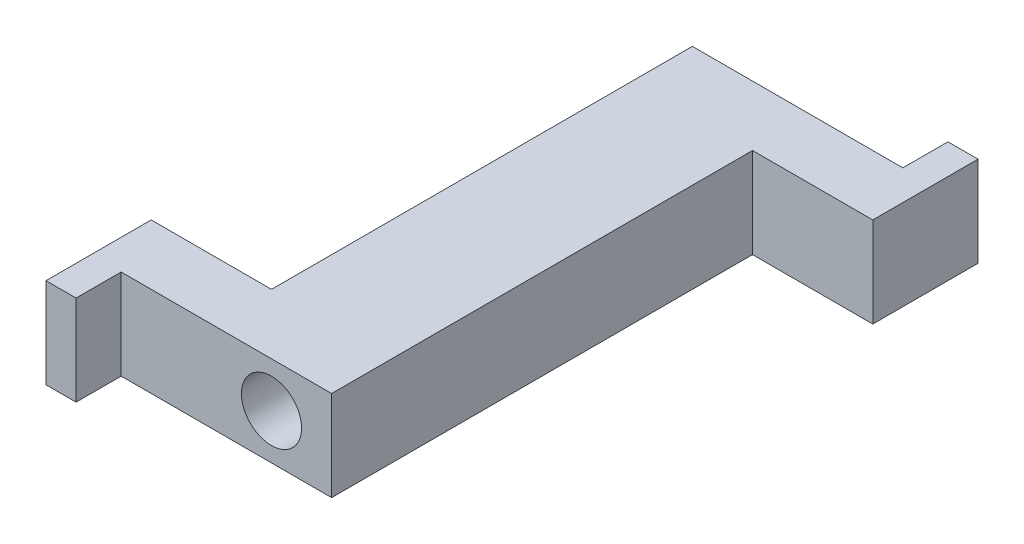
ISO-10303-21;
HEADER;
FILE_DESCRIPTION(('STEP AP214'),'2;1');
FILE_NAME('part.step','',(''),(''),'','','');
FILE_SCHEMA(('AUTOMOTIVE_DESIGN { 1 0 10303 214 1 1 1 1 }'));
ENDSEC;
DATA;
#1=APPLICATION_CONTEXT('core data for automotive mechanical design processes');
#2=APPLICATION_PROTOCOL_DEFINITION('international standard','automotive_design',2000,#1);
#3=PRODUCT_CONTEXT('',#1,'mechanical');
#4=PRODUCT('Part','Part','',(#3));
#5=PRODUCT_RELATED_PRODUCT_CATEGORY('part','',(#4));
#6=PRODUCT_DEFINITION_FORMATION('','',#4);
#7=PRODUCT_DEFINITION_CONTEXT('part definition',#1,'design');
#8=PRODUCT_DEFINITION('design','',#6,#7);
#9=PRODUCT_DEFINITION_SHAPE('','',#8);
#10=(LENGTH_UNIT() NAMED_UNIT(*) SI_UNIT(.MILLI.,.METRE.));
#11=(NAMED_UNIT(*) PLANE_ANGLE_UNIT() SI_UNIT($,.RADIAN.));
#12=(NAMED_UNIT(*) SI_UNIT($,.STERADIAN.) SOLID_ANGLE_UNIT());
#13=UNCERTAINTY_MEASURE_WITH_UNIT(LENGTH_MEASURE(1.E-05),#10,'distance_accuracy_value','');
#14=(GEOMETRIC_REPRESENTATION_CONTEXT(3) GLOBAL_UNCERTAINTY_ASSIGNED_CONTEXT((#13)) GLOBAL_UNIT_ASSIGNED_CONTEXT((#10,
#11,#12)) REPRESENTATION_CONTEXT('',''));
#15=CARTESIAN_POINT('',(0.,0.,0.));
#16=DIRECTION('',(0.,0.,1.));
#17=DIRECTION('',(1.,0.,0.));
#18=AXIS2_PLACEMENT_3D('',#15,#16,#17);
#19=CARTESIAN_POINT('',(0.,0.,0.));
#20=DIRECTION('',(0.,0.,-1.));
#21=DIRECTION('',(-1.,0.,0.));
#22=AXIS2_PLACEMENT_3D('',#19,#20,#21);
#23=PLANE('',#22);
#24=CARTESIAN_POINT('',(-12.7,9.525,0.));
#25=DIRECTION('',(0.,0.,1.));
#26=DIRECTION('',(1.,0.,0.));
#27=AXIS2_PLACEMENT_3D('',#24,#25,#26);
#28=CIRCLE('',#27,6.35);
#29=CARTESIAN_POINT('',(-6.35,9.525,0.));
#30=VERTEX_POINT('',#29);
#31=EDGE_CURVE('E197',#30,#30,#28,.T.);
#32=ORIENTED_EDGE('',*,*,#31,.T.);
#33=EDGE_LOOP('',(#32));
#34=FACE_BOUND('',#33,.T.);
#35=DIRECTION('',(-1.,0.,0.));
#36=VECTOR('',#35,1.);
#37=CARTESIAN_POINT('',(0.,19.05,0.));
#38=LINE('',#37,#36);
#39=CARTESIAN_POINT('',(19.05,19.05,0.));
#40=VERTEX_POINT('',#39);
#41=CARTESIAN_POINT('',(-25.4,19.05,0.));
#42=VERTEX_POINT('',#41);
#43=EDGE_CURVE('E207',#40,#42,#38,.T.);
#44=ORIENTED_EDGE('',*,*,#43,.F.);
#45=DIRECTION('',(0.,-1.,0.));
#46=VECTOR('',#45,1.);
#47=CARTESIAN_POINT('',(19.05,19.05,0.));
#48=LINE('',#47,#46);
#49=CARTESIAN_POINT('',(19.05,0.,0.));
#50=VERTEX_POINT('',#49);
#51=EDGE_CURVE('E127',#40,#50,#48,.T.);
#52=ORIENTED_EDGE('',*,*,#51,.T.);
#53=DIRECTION('',(-1.,0.,0.));
#54=VECTOR('',#53,1.);
#55=CARTESIAN_POINT('',(0.,0.,0.));
#56=LINE('',#55,#54);
#57=CARTESIAN_POINT('',(-25.4,0.,0.));
#58=VERTEX_POINT('',#57);
#59=EDGE_CURVE('E200',#50,#58,#56,.T.);
#60=ORIENTED_EDGE('',*,*,#59,.T.);
#61=DIRECTION('',(0.,1.,0.));
#62=VECTOR('',#61,1.);
#63=CARTESIAN_POINT('',(-25.4,0.,0.));
#64=LINE('',#63,#62);
#65=EDGE_CURVE('E212',#58,#42,#64,.T.);
#66=ORIENTED_EDGE('',*,*,#65,.T.);
#67=EDGE_LOOP('',(#44,#52,#60,#66));
#68=FACE_BOUND('',#67,.T.);
#69=ADVANCED_FACE('F33',(#34,#68),#23,.T.);
#70=CARTESIAN_POINT('',(0.,0.,101.6));
#71=DIRECTION('',(0.,0.,-1.));
#72=DIRECTION('',(-1.,0.,0.));
#73=AXIS2_PLACEMENT_3D('',#70,#71,#72);
#74=PLANE('',#73);
#75=CARTESIAN_POINT('',(-12.7,9.525,101.6));
#76=DIRECTION('',(0.,0.,1.));
#77=DIRECTION('',(1.,0.,0.));
#78=AXIS2_PLACEMENT_3D('',#75,#76,#77);
#79=CIRCLE('',#78,6.35);
#80=CARTESIAN_POINT('',(-6.35,9.525,101.6));
#81=VERTEX_POINT('',#80);
#82=EDGE_CURVE('E196',#81,#81,#79,.T.);
#83=ORIENTED_EDGE('',*,*,#82,.F.);
#84=EDGE_LOOP('',(#83));
#85=FACE_BOUND('',#84,.T.);
#86=DIRECTION('',(0.,1.,0.));
#87=VECTOR('',#86,1.);
#88=CARTESIAN_POINT('',(-44.45,0.,101.6));
#89=LINE('',#88,#87);
#90=CARTESIAN_POINT('',(-44.45,0.,101.6));
#91=VERTEX_POINT('',#90);
#92=CARTESIAN_POINT('',(-44.45,19.05,101.6));
#93=VERTEX_POINT('',#92);
#94=EDGE_CURVE('E161',#91,#93,#89,.T.);
#95=ORIENTED_EDGE('',*,*,#94,.F.);
#96=DIRECTION('',(-1.,0.,0.));
#97=VECTOR('',#96,1.);
#98=CARTESIAN_POINT('',(0.,0.,101.6));
#99=LINE('',#98,#97);
#100=CARTESIAN_POINT('',(0.,0.,101.6));
#101=VERTEX_POINT('',#100);
#102=EDGE_CURVE('E203',#101,#91,#99,.T.);
#103=ORIENTED_EDGE('',*,*,#102,.F.);
#104=DIRECTION('',(0.,1.,0.));
#105=VECTOR('',#104,1.);
#106=CARTESIAN_POINT('',(0.,0.,101.6));
#107=LINE('',#106,#105);
#108=CARTESIAN_POINT('',(0.,19.05,101.6));
#109=VERTEX_POINT('',#108);
#110=EDGE_CURVE('E209',#101,#109,#107,.T.);
#111=ORIENTED_EDGE('',*,*,#110,.T.);
#112=DIRECTION('',(-1.,0.,0.));
#113=VECTOR('',#112,1.);
#114=CARTESIAN_POINT('',(0.,19.05,101.6));
#115=LINE('',#114,#113);
#116=EDGE_CURVE('E206',#109,#93,#115,.T.);
#117=ORIENTED_EDGE('',*,*,#116,.T.);
#118=EDGE_LOOP('',(#95,#103,#111,#117));
#119=FACE_BOUND('',#118,.T.);
#120=ADVANCED_FACE('F248',(#85,#119),#74,.F.);
#121=CARTESIAN_POINT('',(-25.4,0.,101.6));
#122=DIRECTION('',(-1.,0.,0.));
#123=DIRECTION('',(0.,0.,1.));
#124=AXIS2_PLACEMENT_3D('',#121,#122,#123);
#125=PLANE('',#124);
#126=DIRECTION('',(0.,0.,-1.));
#127=VECTOR('',#126,1.);
#128=CARTESIAN_POINT('',(-25.4,0.,101.6));
#129=LINE('',#128,#127);
#130=CARTESIAN_POINT('',(-25.4,0.,88.9));
#131=VERTEX_POINT('',#130);
#132=EDGE_CURVE('E37',#131,#58,#129,.T.);
#133=ORIENTED_EDGE('',*,*,#132,.F.);
#134=DIRECTION('',(0.,1.,0.));
#135=VECTOR('',#134,1.);
#136=CARTESIAN_POINT('',(-25.4,-28.3980633142473,88.9));
#137=LINE('',#136,#135);
#138=CARTESIAN_POINT('',(-25.4,19.05,88.9));
#139=VERTEX_POINT('',#138);
#140=EDGE_CURVE('E192',#131,#139,#137,.T.);
#141=ORIENTED_EDGE('',*,*,#140,.T.);
#142=DIRECTION('',(0.,0.,-1.));
#143=VECTOR('',#142,1.);
#144=CARTESIAN_POINT('',(-25.4,19.05,101.6));
#145=LINE('',#144,#143);
#146=EDGE_CURVE('E217',#139,#42,#145,.T.);
#147=ORIENTED_EDGE('',*,*,#146,.T.);
#148=ORIENTED_EDGE('',*,*,#65,.F.);
#149=EDGE_LOOP('',(#133,#141,#147,#148));
#150=FACE_BOUND('',#149,.T.);
#151=ADVANCED_FACE('F227',(#150),#125,.T.);
#152=CARTESIAN_POINT('',(0.,0.,101.6));
#153=DIRECTION('',(0.,-1.,0.));
#154=DIRECTION('',(0.,0.,-1.));
#155=AXIS2_PLACEMENT_3D('',#152,#153,#154);
#156=PLANE('',#155);
#157=ORIENTED_EDGE('',*,*,#59,.F.);
#158=DIRECTION('',(0.,0.,1.));
#159=VECTOR('',#158,1.);
#160=CARTESIAN_POINT('',(19.05,0.,-9.525));
#161=LINE('',#160,#159);
#162=CARTESIAN_POINT('',(19.05,0.,-9.525));
#163=VERTEX_POINT('',#162);
#164=EDGE_CURVE('E50',#163,#50,#161,.T.);
#165=ORIENTED_EDGE('',*,*,#164,.F.);
#166=DIRECTION('',(-1.,0.,0.));
#167=VECTOR('',#166,1.);
#168=CARTESIAN_POINT('',(25.4,0.,-9.525));
#169=LINE('',#168,#167);
#170=CARTESIAN_POINT('',(25.4,0.,-9.525));
#171=VERTEX_POINT('',#170);
#172=EDGE_CURVE('E139',#171,#163,#169,.T.);
#173=ORIENTED_EDGE('',*,*,#172,.F.);
#174=DIRECTION('',(0.,0.,1.));
#175=VECTOR('',#174,1.);
#176=CARTESIAN_POINT('',(25.4,0.,0.));
#177=LINE('',#176,#175);
#178=CARTESIAN_POINT('',(25.4,0.,12.7));
#179=VERTEX_POINT('',#178);
#180=EDGE_CURVE('E154',#171,#179,#177,.T.);
#181=ORIENTED_EDGE('',*,*,#180,.T.);
#182=DIRECTION('',(1.,0.,0.));
#183=VECTOR('',#182,1.);
#184=CARTESIAN_POINT('',(0.,0.,12.7));
#185=LINE('',#184,#183);
#186=CARTESIAN_POINT('',(0.,0.,12.7));
#187=VERTEX_POINT('',#186);
#188=EDGE_CURVE('E151',#187,#179,#185,.T.);
#189=ORIENTED_EDGE('',*,*,#188,.F.);
#190=DIRECTION('',(0.,0.,-1.));
#191=VECTOR('',#190,1.);
#192=CARTESIAN_POINT('',(0.,0.,101.6));
#193=LINE('',#192,#191);
#194=EDGE_CURVE('E11',#101,#187,#193,.T.);
#195=ORIENTED_EDGE('',*,*,#194,.F.);
#196=ORIENTED_EDGE('',*,*,#102,.T.);
#197=DIRECTION('',(0.,0.,-1.));
#198=VECTOR('',#197,1.);
#199=CARTESIAN_POINT('',(-44.45,0.,111.125));
#200=LINE('',#199,#198);
#201=CARTESIAN_POINT('',(-44.45,0.,111.125));
#202=VERTEX_POINT('',#201);
#203=EDGE_CURVE('E178',#202,#91,#200,.T.);
#204=ORIENTED_EDGE('',*,*,#203,.F.);
#205=DIRECTION('',(1.,0.,0.));
#206=VECTOR('',#205,1.);
#207=CARTESIAN_POINT('',(-50.8,0.,111.125));
#208=LINE('',#207,#206);
#209=CARTESIAN_POINT('',(-50.8,0.,111.125));
#210=VERTEX_POINT('',#209);
#211=EDGE_CURVE('E166',#210,#202,#208,.T.);
#212=ORIENTED_EDGE('',*,*,#211,.F.);
#213=DIRECTION('',(0.,0.,1.));
#214=VECTOR('',#213,1.);
#215=CARTESIAN_POINT('',(-50.8,0.,101.6));
#216=LINE('',#215,#214);
#217=CARTESIAN_POINT('',(-50.8,0.,88.9));
#218=VERTEX_POINT('',#217);
#219=EDGE_CURVE('E190',#218,#210,#216,.T.);
#220=ORIENTED_EDGE('',*,*,#219,.F.);
#221=DIRECTION('',(-1.,0.,0.));
#222=VECTOR('',#221,1.);
#223=CARTESIAN_POINT('',(-25.4,0.,88.9));
#224=LINE('',#223,#222);
#225=EDGE_CURVE('E184',#131,#218,#224,.T.);
#226=ORIENTED_EDGE('',*,*,#225,.F.);
#227=ORIENTED_EDGE('',*,*,#132,.T.);
#228=EDGE_LOOP('',(#157,#165,#173,#181,#189,#195,#196,#204,#212,#220,#226,#227));
#229=FACE_BOUND('',#228,.T.);
#230=ADVANCED_FACE('F35',(#229),#156,.T.);
#231=CARTESIAN_POINT('',(0.,0.,101.6));
#232=DIRECTION('',(-1.,0.,0.));
#233=DIRECTION('',(0.,0.,1.));
#234=AXIS2_PLACEMENT_3D('',#231,#232,#233);
#235=PLANE('',#234);
#236=ORIENTED_EDGE('',*,*,#194,.T.);
#237=DIRECTION('',(0.,1.,0.));
#238=VECTOR('',#237,1.);
#239=CARTESIAN_POINT('',(0.,0.,12.7));
#240=LINE('',#239,#238);
#241=CARTESIAN_POINT('',(0.,19.05,12.7));
#242=VERTEX_POINT('',#241);
#243=EDGE_CURVE('E156',#187,#242,#240,.T.);
#244=ORIENTED_EDGE('',*,*,#243,.T.);
#245=DIRECTION('',(0.,0.,-1.));
#246=VECTOR('',#245,1.);
#247=CARTESIAN_POINT('',(0.,19.05,101.6));
#248=LINE('',#247,#246);
#249=EDGE_CURVE('E42',#109,#242,#248,.T.);
#250=ORIENTED_EDGE('',*,*,#249,.F.);
#251=ORIENTED_EDGE('',*,*,#110,.F.);
#252=EDGE_LOOP('',(#236,#244,#250,#251));
#253=FACE_BOUND('',#252,.T.);
#254=ADVANCED_FACE('F253',(#253),#235,.F.);
#255=CARTESIAN_POINT('',(0.,19.05,101.6));
#256=DIRECTION('',(0.,-1.,0.));
#257=DIRECTION('',(1.,0.,0.));
#258=AXIS2_PLACEMENT_3D('',#255,#256,#257);
#259=PLANE('',#258);
#260=DIRECTION('',(0.,0.,1.));
#261=VECTOR('',#260,1.);
#262=CARTESIAN_POINT('',(25.4,19.05,0.));
#263=LINE('',#262,#261);
#264=CARTESIAN_POINT('',(25.4,19.05,-9.525));
#265=VERTEX_POINT('',#264);
#266=CARTESIAN_POINT('',(25.4,19.05,12.7));
#267=VERTEX_POINT('',#266);
#268=EDGE_CURVE('E143',#265,#267,#263,.T.);
#269=ORIENTED_EDGE('',*,*,#268,.F.);
#270=DIRECTION('',(-1.,0.,0.));
#271=VECTOR('',#270,1.);
#272=CARTESIAN_POINT('',(25.4,19.05,-9.525));
#273=LINE('',#272,#271);
#274=CARTESIAN_POINT('',(19.05,19.05,-9.525));
#275=VERTEX_POINT('',#274);
#276=EDGE_CURVE('E137',#265,#275,#273,.T.);
#277=ORIENTED_EDGE('',*,*,#276,.T.);
#278=DIRECTION('',(0.,0.,1.));
#279=VECTOR('',#278,1.);
#280=CARTESIAN_POINT('',(19.05,19.05,-9.525));
#281=LINE('',#280,#279);
#282=EDGE_CURVE('E123',#275,#40,#281,.T.);
#283=ORIENTED_EDGE('',*,*,#282,.T.);
#284=ORIENTED_EDGE('',*,*,#43,.T.);
#285=ORIENTED_EDGE('',*,*,#146,.F.);
#286=DIRECTION('',(-1.,0.,0.));
#287=VECTOR('',#286,1.);
#288=CARTESIAN_POINT('',(-25.4,19.05,88.9));
#289=LINE('',#288,#287);
#290=CARTESIAN_POINT('',(-50.8,19.05,88.9));
#291=VERTEX_POINT('',#290);
#292=EDGE_CURVE('E181',#139,#291,#289,.T.);
#293=ORIENTED_EDGE('',*,*,#292,.T.);
#294=DIRECTION('',(0.,0.,1.));
#295=VECTOR('',#294,1.);
#296=CARTESIAN_POINT('',(-50.8,19.05,101.6));
#297=LINE('',#296,#295);
#298=CARTESIAN_POINT('',(-50.8,19.05,111.125));
#299=VERTEX_POINT('',#298);
#300=EDGE_CURVE('E182',#291,#299,#297,.T.);
#301=ORIENTED_EDGE('',*,*,#300,.T.);
#302=DIRECTION('',(-1.,0.,0.));
#303=VECTOR('',#302,1.);
#304=CARTESIAN_POINT('',(-50.8,19.05,111.125));
#305=LINE('',#304,#303);
#306=CARTESIAN_POINT('',(-44.45,19.05,111.125));
#307=VERTEX_POINT('',#306);
#308=EDGE_CURVE('E170',#307,#299,#305,.T.);
#309=ORIENTED_EDGE('',*,*,#308,.F.);
#310=DIRECTION('',(0.,0.,-1.));
#311=VECTOR('',#310,1.);
#312=CARTESIAN_POINT('',(-44.45,19.05,111.125));
#313=LINE('',#312,#311);
#314=EDGE_CURVE('E173',#307,#93,#313,.T.);
#315=ORIENTED_EDGE('',*,*,#314,.T.);
#316=ORIENTED_EDGE('',*,*,#116,.F.);
#317=ORIENTED_EDGE('',*,*,#249,.T.);
#318=DIRECTION('',(1.,0.,0.));
#319=VECTOR('',#318,1.);
#320=CARTESIAN_POINT('',(0.,19.05,12.7));
#321=LINE('',#320,#319);
#322=EDGE_CURVE('E58',#242,#267,#321,.T.);
#323=ORIENTED_EDGE('',*,*,#322,.T.);
#324=EDGE_LOOP('',(#269,#277,#283,#284,#285,#293,#301,#309,#315,#316,#317,#323));
#325=FACE_BOUND('',#324,.T.);
#326=ADVANCED_FACE('F141',(#325),#259,.F.);
#327=CARTESIAN_POINT('',(-12.7,9.525,0.));
#328=DIRECTION('',(0.,0.,1.));
#329=DIRECTION('',(1.,0.,0.));
#330=AXIS2_PLACEMENT_3D('',#327,#328,#329);
#331=CYLINDRICAL_SURFACE('',#330,6.35);
#332=ORIENTED_EDGE('',*,*,#31,.F.);
#333=EDGE_LOOP('',(#332));
#334=FACE_BOUND('',#333,.T.);
#335=ORIENTED_EDGE('',*,*,#82,.T.);
#336=EDGE_LOOP('',(#335));
#337=FACE_BOUND('',#336,.T.);
#338=ADVANCED_FACE('F281',(#334,#337),#331,.F.);
#339=CARTESIAN_POINT('',(-25.4,-28.3980633142473,88.9));
#340=DIRECTION('',(0.,0.,-1.));
#341=DIRECTION('',(-1.,0.,0.));
#342=AXIS2_PLACEMENT_3D('',#339,#340,#341);
#343=PLANE('',#342);
#344=ORIENTED_EDGE('',*,*,#140,.F.);
#345=ORIENTED_EDGE('',*,*,#225,.T.);
#346=DIRECTION('',(0.,1.,0.));
#347=VECTOR('',#346,1.);
#348=CARTESIAN_POINT('',(-50.8,-28.3980633142473,88.9));
#349=LINE('',#348,#347);
#350=EDGE_CURVE('E189',#218,#291,#349,.T.);
#351=ORIENTED_EDGE('',*,*,#350,.T.);
#352=ORIENTED_EDGE('',*,*,#292,.F.);
#353=EDGE_LOOP('',(#344,#345,#351,#352));
#354=FACE_BOUND('',#353,.T.);
#355=ADVANCED_FACE('F232',(#354),#343,.T.);
#356=CARTESIAN_POINT('',(-50.8,-28.3980633142473,101.6));
#357=DIRECTION('',(-1.,0.,0.));
#358=DIRECTION('',(0.,-1.,0.));
#359=AXIS2_PLACEMENT_3D('',#356,#357,#358);
#360=PLANE('',#359);
#361=ORIENTED_EDGE('',*,*,#350,.F.);
#362=ORIENTED_EDGE('',*,*,#219,.T.);
#363=DIRECTION('',(0.,-1.,0.));
#364=VECTOR('',#363,1.);
#365=CARTESIAN_POINT('',(-50.8,0.,111.125));
#366=LINE('',#365,#364);
#367=EDGE_CURVE('E163',#299,#210,#366,.T.);
#368=ORIENTED_EDGE('',*,*,#367,.F.);
#369=ORIENTED_EDGE('',*,*,#300,.F.);
#370=EDGE_LOOP('',(#361,#362,#368,#369));
#371=FACE_BOUND('',#370,.T.);
#372=ADVANCED_FACE('F236',(#371),#360,.T.);
#373=CARTESIAN_POINT('',(-44.45,0.,111.125));
#374=DIRECTION('',(-1.,0.,0.));
#375=DIRECTION('',(0.,0.,1.));
#376=AXIS2_PLACEMENT_3D('',#373,#374,#375);
#377=PLANE('',#376);
#378=ORIENTED_EDGE('',*,*,#94,.T.);
#379=ORIENTED_EDGE('',*,*,#314,.F.);
#380=DIRECTION('',(0.,1.,0.));
#381=VECTOR('',#380,1.);
#382=CARTESIAN_POINT('',(-44.45,0.,111.125));
#383=LINE('',#382,#381);
#384=EDGE_CURVE('E168',#202,#307,#383,.T.);
#385=ORIENTED_EDGE('',*,*,#384,.F.);
#386=ORIENTED_EDGE('',*,*,#203,.T.);
#387=EDGE_LOOP('',(#378,#379,#385,#386));
#388=FACE_BOUND('',#387,.T.);
#389=ADVANCED_FACE('F245',(#388),#377,.F.);
#390=CARTESIAN_POINT('',(0.,0.,111.125));
#391=DIRECTION('',(0.,0.,-1.));
#392=DIRECTION('',(-1.,0.,0.));
#393=AXIS2_PLACEMENT_3D('',#390,#391,#392);
#394=PLANE('',#393);
#395=ORIENTED_EDGE('',*,*,#367,.T.);
#396=ORIENTED_EDGE('',*,*,#211,.T.);
#397=ORIENTED_EDGE('',*,*,#384,.T.);
#398=ORIENTED_EDGE('',*,*,#308,.T.);
#399=EDGE_LOOP('',(#395,#396,#397,#398));
#400=FACE_BOUND('',#399,.T.);
#401=ADVANCED_FACE('F239',(#400),#394,.F.);
#402=CARTESIAN_POINT('',(25.4,0.,0.));
#403=DIRECTION('',(-1.,0.,0.));
#404=DIRECTION('',(0.,-1.,0.));
#405=AXIS2_PLACEMENT_3D('',#402,#403,#404);
#406=PLANE('',#405);
#407=ORIENTED_EDGE('',*,*,#268,.T.);
#408=DIRECTION('',(0.,1.,0.));
#409=VECTOR('',#408,1.);
#410=CARTESIAN_POINT('',(25.4,0.,12.7));
#411=LINE('',#410,#409);
#412=EDGE_CURVE('E159',#179,#267,#411,.T.);
#413=ORIENTED_EDGE('',*,*,#412,.F.);
#414=ORIENTED_EDGE('',*,*,#180,.F.);
#415=DIRECTION('',(0.,-1.,0.));
#416=VECTOR('',#415,1.);
#417=CARTESIAN_POINT('',(25.4,19.05,-9.525));
#418=LINE('',#417,#416);
#419=EDGE_CURVE('E131',#265,#171,#418,.T.);
#420=ORIENTED_EDGE('',*,*,#419,.F.);
#421=EDGE_LOOP('',(#407,#413,#414,#420));
#422=FACE_BOUND('',#421,.T.);
#423=ADVANCED_FACE('F257',(#422),#406,.F.);
#424=CARTESIAN_POINT('',(0.,0.,12.7));
#425=DIRECTION('',(0.,0.,1.));
#426=DIRECTION('',(1.,0.,0.));
#427=AXIS2_PLACEMENT_3D('',#424,#425,#426);
#428=PLANE('',#427);
#429=ORIENTED_EDGE('',*,*,#322,.F.);
#430=ORIENTED_EDGE('',*,*,#243,.F.);
#431=ORIENTED_EDGE('',*,*,#188,.T.);
#432=ORIENTED_EDGE('',*,*,#412,.T.);
#433=EDGE_LOOP('',(#429,#430,#431,#432));
#434=FACE_BOUND('',#433,.T.);
#435=ADVANCED_FACE('F254',(#434),#428,.T.);
#436=CARTESIAN_POINT('',(19.05,19.05,-9.525));
#437=DIRECTION('',(-1.,0.,0.));
#438=DIRECTION('',(0.,-1.,0.));
#439=AXIS2_PLACEMENT_3D('',#436,#437,#438);
#440=PLANE('',#439);
#441=ORIENTED_EDGE('',*,*,#51,.F.);
#442=ORIENTED_EDGE('',*,*,#282,.F.);
#443=DIRECTION('',(0.,-1.,0.));
#444=VECTOR('',#443,1.);
#445=CARTESIAN_POINT('',(19.05,19.05,-9.525));
#446=LINE('',#445,#444);
#447=EDGE_CURVE('E126',#275,#163,#446,.T.);
#448=ORIENTED_EDGE('',*,*,#447,.T.);
#449=ORIENTED_EDGE('',*,*,#164,.T.);
#450=EDGE_LOOP('',(#441,#442,#448,#449));
#451=FACE_BOUND('',#450,.T.);
#452=ADVANCED_FACE('F125',(#451),#440,.T.);
#453=CARTESIAN_POINT('',(0.,0.,-9.525));
#454=DIRECTION('',(0.,0.,1.));
#455=DIRECTION('',(1.,0.,0.));
#456=AXIS2_PLACEMENT_3D('',#453,#454,#455);
#457=PLANE('',#456);
#458=ORIENTED_EDGE('',*,*,#276,.F.);
#459=ORIENTED_EDGE('',*,*,#419,.T.);
#460=ORIENTED_EDGE('',*,*,#172,.T.);
#461=ORIENTED_EDGE('',*,*,#447,.F.);
#462=EDGE_LOOP('',(#458,#459,#460,#461));
#463=FACE_BOUND('',#462,.T.);
#464=ADVANCED_FACE('F135',(#463),#457,.F.);
#465=CLOSED_SHELL('',(#69,#120,#151,#230,#254,#326,#338,#355,#372,#389,#401,#423,#435,#452,#464));
#466=MANIFOLD_SOLID_BREP('B2',#465);
#467=ADVANCED_BREP_SHAPE_REPRESENTATION('',(#18,#466),#14);
#468=SHAPE_DEFINITION_REPRESENTATION(#9,#467);
ENDSEC;
END-ISO-10303-21;
